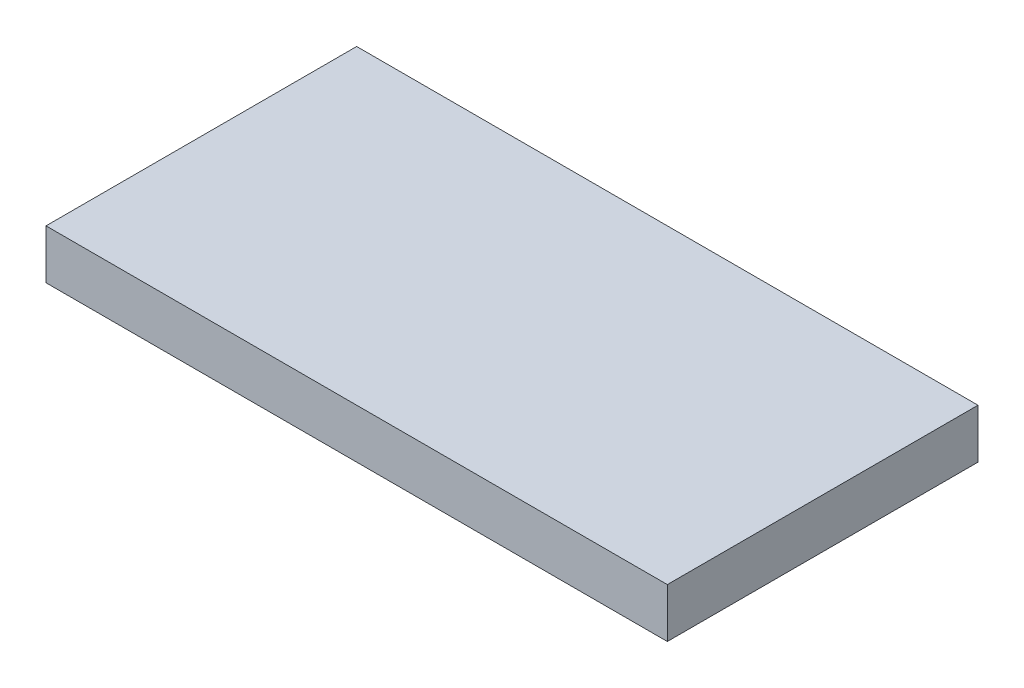
ISO-10303-21;
HEADER;
FILE_DESCRIPTION(('STEP AP214'),'2;1');
FILE_NAME('part.step','',(''),(''),'','','');
FILE_SCHEMA(('AUTOMOTIVE_DESIGN { 1 0 10303 214 1 1 1 1 }'));
ENDSEC;
DATA;
#1=APPLICATION_CONTEXT('core data for automotive mechanical design processes');
#2=APPLICATION_PROTOCOL_DEFINITION('international standard','automotive_design',2000,#1);
#3=PRODUCT_CONTEXT('',#1,'mechanical');
#4=PRODUCT('Part','Part','',(#3));
#5=PRODUCT_RELATED_PRODUCT_CATEGORY('part','',(#4));
#6=PRODUCT_DEFINITION_FORMATION('','',#4);
#7=PRODUCT_DEFINITION_CONTEXT('part definition',#1,'design');
#8=PRODUCT_DEFINITION('design','',#6,#7);
#9=PRODUCT_DEFINITION_SHAPE('','',#8);
#10=(LENGTH_UNIT() NAMED_UNIT(*) SI_UNIT(.MILLI.,.METRE.));
#11=(NAMED_UNIT(*) PLANE_ANGLE_UNIT() SI_UNIT($,.RADIAN.));
#12=(NAMED_UNIT(*) SI_UNIT($,.STERADIAN.) SOLID_ANGLE_UNIT());
#13=UNCERTAINTY_MEASURE_WITH_UNIT(LENGTH_MEASURE(1.E-05),#10,'distance_accuracy_value','');
#14=(GEOMETRIC_REPRESENTATION_CONTEXT(3) GLOBAL_UNCERTAINTY_ASSIGNED_CONTEXT((#13)) GLOBAL_UNIT_ASSIGNED_CONTEXT((#10,
#11,#12)) REPRESENTATION_CONTEXT('',''));
#15=CARTESIAN_POINT('',(0.,0.,0.));
#16=DIRECTION('',(0.,0.,1.));
#17=DIRECTION('',(1.,0.,0.));
#18=AXIS2_PLACEMENT_3D('',#15,#16,#17);
#19=CARTESIAN_POINT('',(0.,6.35,0.));
#20=DIRECTION('',(1.,0.,0.));
#21=DIRECTION('',(0.,0.,-1.));
#22=AXIS2_PLACEMENT_3D('',#19,#20,#21);
#23=PLANE('',#22);
#24=DIRECTION('',(0.,0.,1.));
#25=VECTOR('',#24,1.);
#26=CARTESIAN_POINT('',(0.,0.,0.));
#27=LINE('',#26,#25);
#28=CARTESIAN_POINT('',(0.,0.,-40.));
#29=VERTEX_POINT('',#28);
#30=CARTESIAN_POINT('',(0.,0.,0.));
#31=VERTEX_POINT('',#30);
#32=EDGE_CURVE('E100',#29,#31,#27,.T.);
#33=ORIENTED_EDGE('',*,*,#32,.T.);
#34=DIRECTION('',(0.,-1.,0.));
#35=VECTOR('',#34,1.);
#36=CARTESIAN_POINT('',(0.,6.35,0.));
#37=LINE('',#36,#35);
#38=CARTESIAN_POINT('',(0.,6.35,0.));
#39=VERTEX_POINT('',#38);
#40=EDGE_CURVE('E11',#39,#31,#37,.T.);
#41=ORIENTED_EDGE('',*,*,#40,.F.);
#42=DIRECTION('',(0.,0.,1.));
#43=VECTOR('',#42,1.);
#44=CARTESIAN_POINT('',(0.,6.35,0.));
#45=LINE('',#44,#43);
#46=CARTESIAN_POINT('',(0.,6.35,-40.));
#47=VERTEX_POINT('',#46);
#48=EDGE_CURVE('E88',#47,#39,#45,.T.);
#49=ORIENTED_EDGE('',*,*,#48,.F.);
#50=DIRECTION('',(0.,-1.,0.));
#51=VECTOR('',#50,1.);
#52=CARTESIAN_POINT('',(0.,6.35,-40.));
#53=LINE('',#52,#51);
#54=EDGE_CURVE('E96',#47,#29,#53,.T.);
#55=ORIENTED_EDGE('',*,*,#54,.T.);
#56=EDGE_LOOP('',(#33,#41,#49,#55));
#57=FACE_BOUND('',#56,.T.);
#58=ADVANCED_FACE('F37',(#57),#23,.F.);
#59=CARTESIAN_POINT('',(0.,6.35,0.));
#60=DIRECTION('',(0.,0.,-1.));
#61=DIRECTION('',(-1.,0.,0.));
#62=AXIS2_PLACEMENT_3D('',#59,#60,#61);
#63=PLANE('',#62);
#64=DIRECTION('',(1.,0.,0.));
#65=VECTOR('',#64,1.);
#66=CARTESIAN_POINT('',(0.,0.,0.));
#67=LINE('',#66,#65);
#68=CARTESIAN_POINT('',(80.,0.,0.));
#69=VERTEX_POINT('',#68);
#70=EDGE_CURVE('E92',#31,#69,#67,.T.);
#71=ORIENTED_EDGE('',*,*,#70,.T.);
#72=DIRECTION('',(0.,-1.,0.));
#73=VECTOR('',#72,1.);
#74=CARTESIAN_POINT('',(80.,6.35,0.));
#75=LINE('',#74,#73);
#76=CARTESIAN_POINT('',(80.,6.35,0.));
#77=VERTEX_POINT('',#76);
#78=EDGE_CURVE('E45',#77,#69,#75,.T.);
#79=ORIENTED_EDGE('',*,*,#78,.F.);
#80=DIRECTION('',(1.,0.,0.));
#81=VECTOR('',#80,1.);
#82=CARTESIAN_POINT('',(0.,6.35,0.));
#83=LINE('',#82,#81);
#84=EDGE_CURVE('E83',#39,#77,#83,.T.);
#85=ORIENTED_EDGE('',*,*,#84,.F.);
#86=ORIENTED_EDGE('',*,*,#40,.T.);
#87=EDGE_LOOP('',(#71,#79,#85,#86));
#88=FACE_BOUND('',#87,.T.);
#89=ADVANCED_FACE('F91',(#88),#63,.F.);
#90=CARTESIAN_POINT('',(80.,6.35,0.));
#91=DIRECTION('',(-1.,0.,0.));
#92=DIRECTION('',(0.,0.,1.));
#93=AXIS2_PLACEMENT_3D('',#90,#91,#92);
#94=PLANE('',#93);
#95=DIRECTION('',(0.,0.,-1.));
#96=VECTOR('',#95,1.);
#97=CARTESIAN_POINT('',(80.,0.,0.));
#98=LINE('',#97,#96);
#99=CARTESIAN_POINT('',(80.,0.,-40.));
#100=VERTEX_POINT('',#99);
#101=EDGE_CURVE('E70',#69,#100,#98,.T.);
#102=ORIENTED_EDGE('',*,*,#101,.T.);
#103=DIRECTION('',(0.,-1.,0.));
#104=VECTOR('',#103,1.);
#105=CARTESIAN_POINT('',(80.,6.35,-40.));
#106=LINE('',#105,#104);
#107=CARTESIAN_POINT('',(80.,6.35,-40.));
#108=VERTEX_POINT('',#107);
#109=EDGE_CURVE('E93',#108,#100,#106,.T.);
#110=ORIENTED_EDGE('',*,*,#109,.F.);
#111=DIRECTION('',(0.,0.,-1.));
#112=VECTOR('',#111,1.);
#113=CARTESIAN_POINT('',(80.,6.35,0.));
#114=LINE('',#113,#112);
#115=EDGE_CURVE('E86',#77,#108,#114,.T.);
#116=ORIENTED_EDGE('',*,*,#115,.F.);
#117=ORIENTED_EDGE('',*,*,#78,.T.);
#118=EDGE_LOOP('',(#102,#110,#116,#117));
#119=FACE_BOUND('',#118,.T.);
#120=ADVANCED_FACE('F94',(#119),#94,.F.);
#121=CARTESIAN_POINT('',(0.,6.35,-40.));
#122=DIRECTION('',(0.,0.,1.));
#123=DIRECTION('',(1.,0.,0.));
#124=AXIS2_PLACEMENT_3D('',#121,#122,#123);
#125=PLANE('',#124);
#126=DIRECTION('',(-1.,0.,0.));
#127=VECTOR('',#126,1.);
#128=CARTESIAN_POINT('',(0.,0.,-40.));
#129=LINE('',#128,#127);
#130=EDGE_CURVE('E76',#100,#29,#129,.T.);
#131=ORIENTED_EDGE('',*,*,#130,.T.);
#132=ORIENTED_EDGE('',*,*,#54,.F.);
#133=DIRECTION('',(-1.,0.,0.));
#134=VECTOR('',#133,1.);
#135=CARTESIAN_POINT('',(0.,6.35,-40.));
#136=LINE('',#135,#134);
#137=EDGE_CURVE('E53',#108,#47,#136,.T.);
#138=ORIENTED_EDGE('',*,*,#137,.F.);
#139=ORIENTED_EDGE('',*,*,#109,.T.);
#140=EDGE_LOOP('',(#131,#132,#138,#139));
#141=FACE_BOUND('',#140,.T.);
#142=ADVANCED_FACE('F107',(#141),#125,.F.);
#143=CARTESIAN_POINT('',(0.,6.35,0.));
#144=DIRECTION('',(0.,-1.,0.));
#145=DIRECTION('',(0.,0.,-1.));
#146=AXIS2_PLACEMENT_3D('',#143,#144,#145);
#147=PLANE('',#146);
#148=ORIENTED_EDGE('',*,*,#48,.T.);
#149=ORIENTED_EDGE('',*,*,#84,.T.);
#150=ORIENTED_EDGE('',*,*,#115,.T.);
#151=ORIENTED_EDGE('',*,*,#137,.T.);
#152=EDGE_LOOP('',(#148,#149,#150,#151));
#153=FACE_BOUND('',#152,.T.);
#154=ADVANCED_FACE('F84',(#153),#147,.F.);
#155=CARTESIAN_POINT('',(0.,0.,0.));
#156=DIRECTION('',(0.,-1.,0.));
#157=DIRECTION('',(0.,0.,-1.));
#158=AXIS2_PLACEMENT_3D('',#155,#156,#157);
#159=PLANE('',#158);
#160=ORIENTED_EDGE('',*,*,#32,.F.);
#161=ORIENTED_EDGE('',*,*,#130,.F.);
#162=ORIENTED_EDGE('',*,*,#101,.F.);
#163=ORIENTED_EDGE('',*,*,#70,.F.);
#164=EDGE_LOOP('',(#160,#161,#162,#163));
#165=FACE_BOUND('',#164,.T.);
#166=ADVANCED_FACE('F110',(#165),#159,.T.);
#167=CLOSED_SHELL('',(#58,#89,#120,#142,#154,#166));
#168=MANIFOLD_SOLID_BREP('B2',#167);
#169=ADVANCED_BREP_SHAPE_REPRESENTATION('',(#18,#168),#14);
#170=SHAPE_DEFINITION_REPRESENTATION(#9,#169);
ENDSEC;
END-ISO-10303-21;
